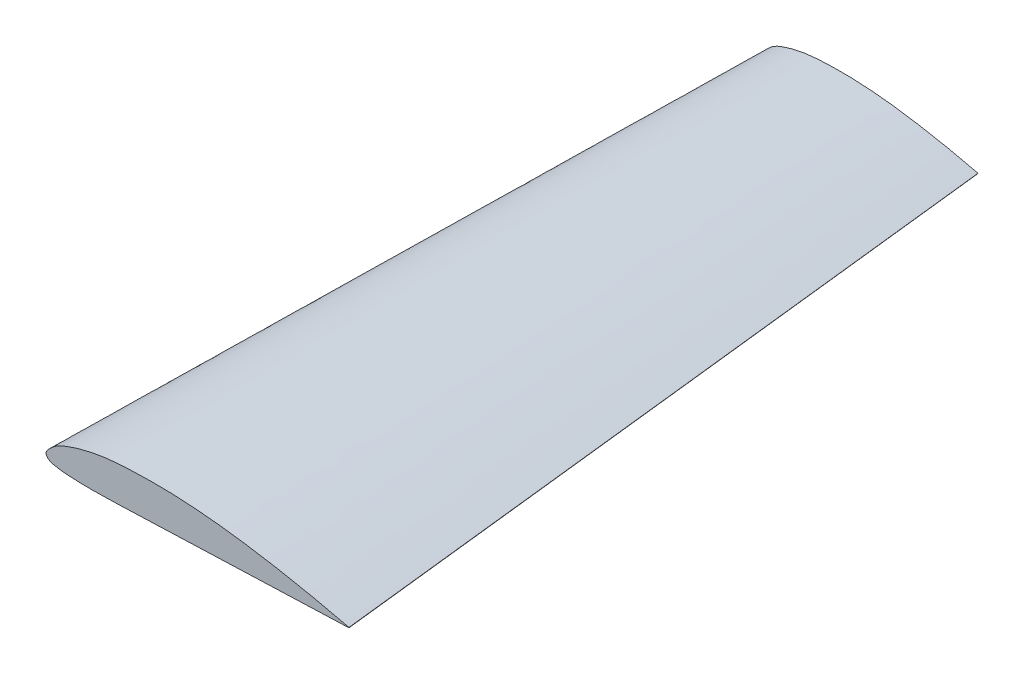
ISO-10303-21;
HEADER;
FILE_DESCRIPTION(('STEP AP214'),'2;1');
FILE_NAME('part.step','',(''),(''),'','','');
FILE_SCHEMA(('AUTOMOTIVE_DESIGN { 1 0 10303 214 1 1 1 1 }'));
ENDSEC;
DATA;
#1=APPLICATION_CONTEXT('core data for automotive mechanical design processes');
#2=APPLICATION_PROTOCOL_DEFINITION('international standard','automotive_design',2000,#1);
#3=PRODUCT_CONTEXT('',#1,'mechanical');
#4=PRODUCT('Part','Part','',(#3));
#5=PRODUCT_RELATED_PRODUCT_CATEGORY('part','',(#4));
#6=PRODUCT_DEFINITION_FORMATION('','',#4);
#7=PRODUCT_DEFINITION_CONTEXT('part definition',#1,'design');
#8=PRODUCT_DEFINITION('design','',#6,#7);
#9=PRODUCT_DEFINITION_SHAPE('','',#8);
#10=(LENGTH_UNIT() NAMED_UNIT(*) SI_UNIT(.MILLI.,.METRE.));
#11=(NAMED_UNIT(*) PLANE_ANGLE_UNIT() SI_UNIT($,.RADIAN.));
#12=(NAMED_UNIT(*) SI_UNIT($,.STERADIAN.) SOLID_ANGLE_UNIT());
#13=UNCERTAINTY_MEASURE_WITH_UNIT(LENGTH_MEASURE(1.E-05),#10,'distance_accuracy_value','');
#14=(GEOMETRIC_REPRESENTATION_CONTEXT(3) GLOBAL_UNCERTAINTY_ASSIGNED_CONTEXT((#13)) GLOBAL_UNIT_ASSIGNED_CONTEXT((#10,
#11,#12)) REPRESENTATION_CONTEXT('',''));
#15=CARTESIAN_POINT('',(0.,0.,0.));
#16=DIRECTION('',(0.,0.,1.));
#17=DIRECTION('',(1.,0.,0.));
#18=AXIS2_PLACEMENT_3D('',#15,#16,#17);
#19=CARTESIAN_POINT('',(12.8168603988164,2.13304577401776,-679.45));
#20=DIRECTION('',(0.,0.,-1.));
#21=DIRECTION('',(-1.,0.,0.));
#22=AXIS2_PLACEMENT_3D('',#19,#20,#21);
#23=PLANE('',#22);
#24=CARTESIAN_POINT('',(215.13815633349,0.121910771375219,-679.45));
#25=CARTESIAN_POINT('',(214.461627755124,0.287633140537885,-679.45));
#26=CARTESIAN_POINT('',(213.110075526926,0.618709231727971,-679.45));
#27=CARTESIAN_POINT('',(211.072202175627,1.07407382505783,-679.45));
#28=CARTESIAN_POINT('',(209.047708211878,1.57931571731317,-679.45));
#29=CARTESIAN_POINT('',(206.335025723878,2.1941886176228,-679.45));
#30=CARTESIAN_POINT('',(202.953557624183,2.98769437172212,-679.45));
#31=CARTESIAN_POINT('',(198.890203629623,3.90389487442927,-679.45));
#32=CARTESIAN_POINT('',(194.827790404657,4.80386244898524,-679.45));
#33=CARTESIAN_POINT('',(190.765256606112,5.68324855934698,-679.45));
#34=CARTESIAN_POINT('',(186.702108723553,6.53929151004852,-679.45));
#35=CARTESIAN_POINT('',(182.642660532388,7.3870883043623,-679.45));
#36=CARTESIAN_POINT('',(178.574031005431,8.16834190715938,-679.45));
#37=CARTESIAN_POINT('',(174.517448076692,8.98425337099883,-679.45));
#38=CARTESIAN_POINT('',(170.448647671062,9.72281472417865,-679.45));
#39=CARTESIAN_POINT('',(166.391523917957,10.4970471799216,-679.45));
#40=CARTESIAN_POINT('',(162.325264552697,11.2012187412181,-679.45));
#41=CARTESIAN_POINT('',(158.265560184403,11.9094790192579,-679.45));
#42=CARTESIAN_POINT('',(154.197683604887,12.5479467883236,-679.45));
#43=CARTESIAN_POINT('',(150.139605517909,13.2202668657995,-679.45));
#44=CARTESIAN_POINT('',(146.073742505185,13.8232141117196,-679.45));
#45=CARTESIAN_POINT('',(142.013236134128,14.4284933351529,-679.45));
#46=CARTESIAN_POINT('',(137.947627508668,14.9706057291833,-679.45));
#47=CARTESIAN_POINT('',(133.888240530522,15.5204263615577,-679.45));
#48=CARTESIAN_POINT('',(129.82162107662,15.9790536434679,-679.45));
#49=CARTESIAN_POINT('',(125.758573586817,16.431325032625,-679.45));
#50=CARTESIAN_POINT('',(121.697975511434,16.8770073746658,-679.45));
#51=CARTESIAN_POINT('',(117.631837295967,17.2327703088552,-679.45));
#52=CARTESIAN_POINT('',(113.569762512434,17.5905536104852,-679.45));
#53=CARTESIAN_POINT('',(109.507034071803,17.9072516278045,-679.45));
#54=CARTESIAN_POINT('',(105.44174698777,18.142632740292,-679.45));
#55=CARTESIAN_POINT('',(101.379082422024,18.3790855703003,-679.45));
#56=CARTESIAN_POINT('',(97.3157119374014,18.5701473352427,-679.45));
#57=CARTESIAN_POINT('',(93.25169220196,18.6979631192171,-679.45));
#58=CARTESIAN_POINT('',(89.1875620448149,18.758524548473,-679.45));
#59=CARTESIAN_POINT('',(85.1237273254981,18.7855451073787,-679.45));
#60=CARTESIAN_POINT('',(81.0597933257808,18.7700945219374,-679.45));
#61=CARTESIAN_POINT('',(76.9958345011567,18.7142216040199,-679.45));
#62=CARTESIAN_POINT('',(72.9317622736009,18.6186635614368,-679.45));
#63=CARTESIAN_POINT('',(68.8678573332756,18.4784207305694,-679.45));
#64=CARTESIAN_POINT('',(64.8022750506451,18.3127317774249,-679.45));
#65=CARTESIAN_POINT('',(60.7376651313413,18.0493154171473,-679.45));
#66=CARTESIAN_POINT('',(56.6715583741981,17.7143915981487,-679.45));
#67=CARTESIAN_POINT('',(52.60475887721,17.2748054416566,-679.45));
#68=CARTESIAN_POINT('',(48.5368072531063,16.7145295151809,-679.45));
#69=CARTESIAN_POINT('',(44.4696352312365,16.0084885761117,-679.45));
#70=CARTESIAN_POINT('',(40.4058892148061,15.1525471084704,-679.45));
#71=CARTESIAN_POINT('',(36.3339504541609,14.1896943309605,-679.45));
#72=CARTESIAN_POINT('',(32.2585901636484,13.0642030914709,-679.45));
#73=CARTESIAN_POINT('',(28.1942977467718,11.713290734651,-679.45));
#74=CARTESIAN_POINT('',(24.7962296292279,10.4638826636869,-679.45));
#75=CARTESIAN_POINT('',(22.0959441999706,9.25949221548522,-679.45));
#76=CARTESIAN_POINT('',(20.0533016162878,8.20108650644846,-679.45));
#77=CARTESIAN_POINT('',(17.9856733335731,6.9628882188768,-679.45));
#78=CARTESIAN_POINT('',(16.076697928172,5.51994943432215,-679.45));
#79=CARTESIAN_POINT('',(14.6339815967281,4.15108521978284,-679.45));
#80=CARTESIAN_POINT('',(13.5544664231668,3.02704135050576,-679.45));
#81=CARTESIAN_POINT('',(12.8553796488538,2.21989769792452,-679.45));
#82=CARTESIAN_POINT('',(12.3940756774489,1.52602711354544,-679.45));
#83=CARTESIAN_POINT('',(12.173110190398,1.06712918763226,-679.45));
#84=CARTESIAN_POINT('',(12.0312090642435,0.673816080280952,-679.45));
#85=CARTESIAN_POINT('',(11.8997018159441,0.106922121723561,-679.45));
#86=CARTESIAN_POINT('',(11.9558628873752,-0.483840935779706,-679.45));
#87=CARTESIAN_POINT('',(12.1758394612667,-0.992014051698573,-679.45));
#88=CARTESIAN_POINT('',(12.3866248079449,-1.403368412154,-679.45));
#89=CARTESIAN_POINT('',(12.841957714916,-2.00024748845596,-679.45));
#90=CARTESIAN_POINT('',(13.5213153027918,-2.63949248012341,-679.45));
#91=CARTESIAN_POINT('',(14.5892915814436,-3.36643737474062,-679.45));
#92=CARTESIAN_POINT('',(16.1035942012592,-3.95545959584553,-679.45));
#93=CARTESIAN_POINT('',(18.0379827737253,-4.33720155880825,-679.45));
#94=CARTESIAN_POINT('',(20.0668386262245,-4.7437273858884,-679.45));
#95=CARTESIAN_POINT('',(22.1007437949092,-5.04814237190061,-679.45));
#96=CARTESIAN_POINT('',(24.8090699579637,-5.34532342561349,-679.45));
#97=CARTESIAN_POINT('',(28.198305191998,-5.56449476584446,-679.45));
#98=CARTESIAN_POINT('',(32.2630359757914,-5.74589414549462,-679.45));
#99=CARTESIAN_POINT('',(36.3268376173975,-5.88637777507348,-679.45));
#100=CARTESIAN_POINT('',(40.3913226140231,-5.9059902482389,-679.45));
#101=CARTESIAN_POINT('',(44.4552635644564,-5.96224211572786,-679.45));
#102=CARTESIAN_POINT('',(48.5186718010782,-5.87079889206543,-679.45));
#103=CARTESIAN_POINT('',(52.5834163882112,-5.84585325811257,-679.45));
#104=CARTESIAN_POINT('',(56.6462590369664,-5.70255305052112,-679.45));
#105=CARTESIAN_POINT('',(60.7107144096735,-5.60054615719551,-679.45));
#106=CARTESIAN_POINT('',(64.774005078364,-5.45165012281856,-679.45));
#107=CARTESIAN_POINT('',(68.8385699308579,-5.32716414193362,-679.45));
#108=CARTESIAN_POINT('',(72.9013167471443,-5.15185667697459,-679.45));
#109=CARTESIAN_POINT('',(76.9663795677223,-5.03365338814612,-679.45));
#110=CARTESIAN_POINT('',(81.0291664427771,-4.85957390609342,-679.45));
#111=CARTESIAN_POINT('',(85.0935710826963,-4.73017668328472,-679.45));
#112=CARTESIAN_POINT('',(89.157936051957,-4.59968085776432,-679.45));
#113=CARTESIAN_POINT('',(93.2208419538443,-4.42889759528012,-679.45));
#114=CARTESIAN_POINT('',(97.285214704454,-4.29861725927932,-679.45));
#115=CARTESIAN_POINT('',(101.349588218249,-4.16835805821858,-679.45));
#116=CARTESIAN_POINT('',(106.766708507238,-3.9405660456554,-679.45));
#117=CARTESIAN_POINT('',(112.187021851742,-3.79392920168495,-679.45));
#118=CARTESIAN_POINT('',(118.958358892466,-3.50919392288966,-679.45));
#119=CARTESIAN_POINT('',(124.378672236358,-3.36255706017908,-679.45));
#120=CARTESIAN_POINT('',(129.795792526876,-3.13476509446928,-679.45));
#121=CARTESIAN_POINT('',(133.860166036391,-3.00450576223564,-679.45));
#122=CARTESIAN_POINT('',(137.924538802971,-2.8742259158015,-679.45));
#123=CARTESIAN_POINT('',(141.987444645249,-2.70344082600662,-679.45));
#124=CARTESIAN_POINT('',(146.051809836945,-2.57295181913593,-679.45));
#125=CARTESIAN_POINT('',(150.116213646706,-2.44352914822967,-679.45));
#126=CARTESIAN_POINT('',(154.179003620324,-2.26954465119212,-679.45));
#127=CARTESIAN_POINT('',(158.244054877825,-2.15098690162749,-679.45));
#128=CARTESIAN_POINT('',(162.306844851464,-1.97700240521967,-679.45));
#129=CARTESIAN_POINT('',(166.371248661143,-1.84757973179484,-679.45));
#130=CARTESIAN_POINT('',(170.43561385315,-1.71709073436901,-679.45));
#131=CARTESIAN_POINT('',(174.498519694268,-1.54630560930904,-679.45));
#132=CARTESIAN_POINT('',(178.562892465175,-1.4160258944706,-679.45));
#133=CARTESIAN_POINT('',(182.627265958541,-1.28576607110368,-679.45));
#134=CARTESIAN_POINT('',(186.690169632013,-1.11492126417963,-679.45));
#135=CARTESIAN_POINT('',(190.754542770925,-0.984651069218046,-679.45));
#136=CARTESIAN_POINT('',(194.818916959679,-0.854412841729266,-679.45));
#137=CARTESIAN_POINT('',(198.881817483236,-0.683472120414775,-679.45));
#138=CARTESIAN_POINT('',(202.946202524654,-0.553563933266129,-679.45));
#139=CARTESIAN_POINT('',(206.333059407276,-0.443908014934658,-679.45));
#140=CARTESIAN_POINT('',(209.042065495297,-0.33902680049291,-679.45));
#141=CARTESIAN_POINT('',(211.073491525938,-0.251790953247334,-679.45));
#142=CARTESIAN_POINT('',(213.106361229738,-0.207431211204091,-679.45));
#143=CARTESIAN_POINT('',(214.460603955381,-0.15042090610083,-679.45));
#144=CARTESIAN_POINT('',(215.13784366651,-0.121910771375068,-679.45));
#145=B_SPLINE_CURVE_WITH_KNOTS('',3,(#24,#25,#26,#27,#28,#29,#30,#31,#32,#33,#34,#35,#36,#37,
#38,#39,#40,#41,#42,#43,#44,#45,#46,#47,#48,#49,#50,#51,#52,#53,#54,#55,#56,#57,#58,#59,#60,#61,
#62,#63,#64,#65,#66,#67,#68,#69,#70,#71,#72,#73,#74,#75,#76,#77,#78,#79,#80,#81,#82,#83,#84,#85,
#86,#87,#88,#89,#90,#91,#92,#93,#94,#95,#96,#97,#98,#99,#100,#101,#102,#103,#104,#105,#106,#107,
#108,#109,#110,#111,#112,#113,#114,#115,#116,#117,#118,#119,#120,#121,#122,#123,#124,#125,#126,
#127,#128,#129,#130,#131,#132,#133,#134,#135,#136,#137,#138,#139,#140,#141,#142,#143,#144),
.UNSPECIFIED.,.F.,.F.,(4,1,1,1,1,1,1,1,1,1,1,1,1,1,1,1,1,1,1,1,1,1,1,1,1,1,1,1,1,1,1,1,1,1,1,1,
1,1,1,1,1,1,1,1,1,1,1,1,1,1,1,1,1,1,1,1,1,1,1,1,1,1,1,1,1,1,1,1,1,1,1,1,1,1,1,1,1,1,1,1,1,1,1,1,
1,1,1,1,1,1,1,1,1,1,1,1,1,1,1,1,1,1,1,1,1,1,1,1,1,1,1,1,1,1,1,1,1,1,4),(0.,0.00503122634557403,
0.0100512607972086,0.0150824871427825,0.0201025215944171,0.0301425904976863,0.0401718067519296,
0.0501903975054945,0.0601985906302054,0.0701966147088251,0.0801846990222892,0.0901535943757596,
0.10012248972923,0.11007312129553,0.120023752861829,0.12995705091697,0.139882032603394,
0.149791085266802,0.159700137930211,0.169594203605189,0.179481130398163,0.189354491215562,
0.199221425918021,0.209070515303594,0.218914135369468,0.228752526355731,0.238576675291738,
0.248396559771628,0.258208641595819,0.268010839279087,0.277810228537083,0.287604731659173,
0.297393734963131,0.307179436892509,0.316964160422912,0.326748883953315,0.336534585882693,
0.346322244316613,0.356112836774261,0.365907339896351,0.375712589303432,0.385532473783322,
0.395376093849195,0.405256118857239,0.415189416912379,0.425187440990999,0.435249893682147,
0.445410814571545,0.455714422442787,0.46618165938066,0.471546485831251,0.477060696794139,
0.482791374930262,0.488936229142053,0.494301055592644,0.497138589947503,0.500195397088939,
0.502000251592252,0.503138171688505,0.503865464460785,0.50501697526504,0.50732933138354,
0.507965330463077,0.509015751951455,0.510659594077608,0.513358796523916,0.515719806809555,
0.519953555254083,0.524973589705718,0.529953413450285,0.534900446287774,0.539822256320711,
0.549630800523053,0.559425303645143,0.569214306949101,0.578999397390584,0.588784120920987,
0.598569822850365,0.608355524779743,0.618144528083701,0.627933531387658,0.637724123845305,
0.647514716302953,0.657307142079014,0.667097734536661,0.676890160312722,0.68668075277037,
0.696471345228017,0.706263771004078,0.716054363461726,0.725844955919373,0.735637381695434,
0.75521856661073,0.76501099238679,0.784592177302086,0.794384603078146,0.804175195535794,
0.813965787993442,0.823758213769502,0.83354880622715,0.843339398684798,0.853131824460858,
0.862922416918506,0.872714842694567,0.882505435152214,0.892296027609862,0.902088453385923,
0.91187904584357,0.921669638301218,0.931462064077279,0.941252656534927,0.951043248992574,
0.960835674768635,0.970626267226283,0.98041685968393,0.985313072571961,0.990209285459991,
0.99510378711197,1.),.UNSPECIFIED.);
#146=CARTESIAN_POINT('',(215.13815633349,0.121910771375168,-679.45));
#147=VERTEX_POINT('',#146);
#148=CARTESIAN_POINT('',(215.13784366651,-0.121910771375119,-679.45));
#149=VERTEX_POINT('',#148);
#150=EDGE_CURVE('E49',#147,#149,#145,.T.);
#151=ORIENTED_EDGE('',*,*,#150,.F.);
#152=DIRECTION('',(0.00128235888977293,0.999999177777501,0.));
#153=VECTOR('',#152,1.);
#154=CARTESIAN_POINT('',(215.13784366651,-0.121910771375119,-679.45));
#155=LINE('',#154,#153);
#156=EDGE_CURVE('E11',#149,#147,#155,.T.);
#157=ORIENTED_EDGE('',*,*,#156,.F.);
#158=EDGE_LOOP('',(#151,#157));
#159=FACE_BOUND('',#158,.T.);
#160=ADVANCED_FACE('F50',(#159),#23,.T.);
#161=CARTESIAN_POINT('',(1.25395659407719,2.68158603818455,0.));
#162=DIRECTION('',(0.,0.,-1.));
#163=DIRECTION('',(-1.,0.,0.));
#164=AXIS2_PLACEMENT_3D('',#161,#162,#163);
#165=PLANE('',#164);
#166=CARTESIAN_POINT('',(290.83,0.174485076899337,0.));
#167=CARTESIAN_POINT('',(289.86141431775,0.410433530204628,0.));
#168=CARTESIAN_POINT('',(287.926397558804,0.881805572719821,0.));
#169=CARTESIAN_POINT('',(285.008855584873,1.529805873877,0.));
#170=CARTESIAN_POINT('',(282.110371315524,2.249217614711,0.));
#171=CARTESIAN_POINT('',(278.226716015357,3.12427564857863,0.));
#172=CARTESIAN_POINT('',(273.385533458274,4.25377447797655,0.));
#173=CARTESIAN_POINT('',(267.568176531703,5.55762864661307,0.));
#174=CARTESIAN_POINT('',(261.752195875157,6.83825116370874,0.));
#175=CARTESIAN_POINT('',(255.936080422435,8.08941623914213,0.));
#176=CARTESIAN_POINT('',(250.119128905491,9.30717029053491,0.));
#177=CARTESIAN_POINT('',(244.307487706619,10.5131288210343,0.));
#178=CARTESIAN_POINT('',(238.482827852898,11.6238305583097,0.));
#179=CARTESIAN_POINT('',(232.675346082458,12.784158468815,0.));
#180=CARTESIAN_POINT('',(226.85052001504,13.8337566107458,0.));
#181=CARTESIAN_POINT('',(221.042340686454,14.9344304488302,0.));
#182=CARTESIAN_POINT('',(215.221214601288,15.9348128653375,0.));
#183=CARTESIAN_POINT('',(209.409462851106,16.9410592885262,0.));
#184=CARTESIAN_POINT('',(203.586142719329,17.8474001850462,0.));
#185=CARTESIAN_POINT('',(197.776784548101,18.8022101814788,0.));
#186=CARTESIAN_POINT('',(191.956411527344,19.6577160253575,0.));
#187=CARTESIAN_POINT('',(186.143700919845,20.5165693434824,0.));
#188=CARTESIAN_POINT('',(180.323803645783,21.2850057732703,0.));
#189=CARTESIAN_POINT('',(174.512796956832,22.0644860381616,0.));
#190=CARTESIAN_POINT('',(168.691606161285,22.7134325470453,0.));
#191=CARTESIAN_POINT('',(162.875539404772,23.3532887404108,0.));
#192=CARTESIAN_POINT('',(157.062990466008,23.9837188557758,0.));
#193=CARTESIAN_POINT('',(151.242677237889,24.4854416515568,0.));
#194=CARTESIAN_POINT('',(145.428176088539,24.9900635561433,0.));
#195=CARTESIAN_POINT('',(139.612814799487,25.4358809483791,0.));
#196=CARTESIAN_POINT('',(133.793940699329,25.7653088255393,0.));
#197=CARTESIAN_POINT('',(127.978818111429,26.0962754116992,0.));
#198=CARTESIAN_POINT('',(122.162768486892,26.3622747409373,0.));
#199=CARTESIAN_POINT('',(116.34590570239,26.5377520691051,0.));
#200=CARTESIAN_POINT('',(110.529008313965,26.6169714002783,0.));
#201=CARTESIAN_POINT('',(104.712595331093,26.6481859034328,0.));
#202=CARTESIAN_POINT('',(98.8961182037374,26.6186133995678,0.));
#203=CARTESIAN_POINT('',(93.0796797359803,26.5311863873011,0.));
#204=CARTESIAN_POINT('',(87.2631517974696,26.3869598327282,0.));
#205=CARTESIAN_POINT('',(81.4469453022673,26.1787784825313,0.));
#206=CARTESIAN_POINT('',(75.6283848141565,25.9341742915949,0.));
#207=CARTESIAN_POINT('',(69.8113953877437,25.5496995351054,0.));
#208=CARTESIAN_POINT('',(63.9923948553843,25.0628769819754,0.));
#209=CARTESIAN_POINT('',(58.1725949340462,24.4262551882097,0.));
#210=CARTESIAN_POINT('',(52.3513675420956,23.6168940481134,0.));
#211=CARTESIAN_POINT('',(46.5315234896791,22.598908166475,0.));
#212=CARTESIAN_POINT('',(40.7168580315844,21.3663834432527,0.));
#213=CARTESIAN_POINT('',(34.890662931066,19.9808268723716,0.));
#214=CARTESIAN_POINT('',(29.059869268968,18.3624877250668,0.));
#215=CARTESIAN_POINT('',(23.2453302337508,16.4215349201997,0.));
#216=CARTESIAN_POINT('',(18.3841384197178,14.6270828963545,0.));
#217=CARTESIAN_POINT('',(14.5215654450137,12.8983430392644,0.));
#218=CARTESIAN_POINT('',(11.599975847482,11.3797508612164,0.));
#219=CARTESIAN_POINT('',(8.64295545581205,9.60378469925065,0.));
#220=CARTESIAN_POINT('',(5.91338276889718,7.53507489154761,0.));
#221=CARTESIAN_POINT('',(3.85100742079764,5.57324007271503,0.));
#222=CARTESIAN_POINT('',(2.30801438747216,3.96247098119062,0.));
#223=CARTESIAN_POINT('',(1.30892786411925,2.80596355053383,0.));
#224=CARTESIAN_POINT('',(0.649960075523071,1.81201461853268,0.));
#225=CARTESIAN_POINT('',(0.334545476011859,1.15481141283316,0.));
#226=CARTESIAN_POINT('',(0.132171369109949,0.591621590821043,0.));
#227=CARTESIAN_POINT('',(-0.0550079138295531,-0.219986745564128,0.));
#228=CARTESIAN_POINT('',(0.0264568922509669,-1.06541328726931,0.));
#229=CARTESIAN_POINT('',(0.342231050395441,-1.79233231282765,0.));
#230=CARTESIAN_POINT('',(0.644672565728293,-2.38069636524275,0.));
#231=CARTESIAN_POINT('',(1.2974632815142,-3.23414382770816,0.));
#232=CARTESIAN_POINT('',(2.27096707642826,-4.14781633610421,0.));
#233=CARTESIAN_POINT('',(3.80084232997736,-5.18629606741227,0.));
#234=CARTESIAN_POINT('',(5.96926901340435,-6.02655479663045,0.));
#235=CARTESIAN_POINT('',(8.738563273625,-6.56937264266873,0.));
#236=CARTESIAN_POINT('',(11.6431093149327,-7.14748901077269,0.));
#237=CARTESIAN_POINT('',(14.5546947780103,-7.57944997150464,0.));
#238=CARTESIAN_POINT('',(18.431532003639,-7.9998195495035,0.));
#239=CARTESIAN_POINT('',(23.2827771510966,-8.30728800078783,0.));
#240=CARTESIAN_POINT('',(29.1007559696777,-8.55945554453759,0.));
#241=CARTESIAN_POINT('',(34.9173298576618,-8.75306412684895,0.));
#242=CARTESIAN_POINT('',(40.7346599532894,-8.77367461387807,0.));
#243=CARTESIAN_POINT('',(46.5512786299366,-8.84672623209345,0.));
#244=CARTESIAN_POINT('',(52.3668637836782,-8.70839023072214,0.));
#245=CARTESIAN_POINT('',(58.184483637262,-8.66522645106263,0.));
#246=CARTESIAN_POINT('',(63.9991641162273,-8.45267118017482,0.));
#247=CARTESIAN_POINT('',(69.8162285951542,-8.29921400484332,0.));
#248=CARTESIAN_POINT('',(75.6315400321908,-8.07864888465471,0.));
#249=CARTESIAN_POINT('',(81.4487199464462,-7.89301831460524,0.));
#250=CARTESIAN_POINT('',(87.2632045197867,-7.63465283290908,0.));
#251=CARTESIAN_POINT('',(93.0811086819688,-7.4580134518254,0.));
#252=CARTESIAN_POINT('',(98.8956528432335,-7.20140544712521,0.));
#253=CARTESIAN_POINT('',(104.71259443926,-7.00874595618586,0.));
#254=CARTESIAN_POINT('',(110.529477240306,-6.81451416294013,0.));
#255=CARTESIAN_POINT('',(116.344197808531,-6.5626236539959,0.));
#256=CARTESIAN_POINT('',(122.161092142137,-6.36870026584062,0.));
#257=CARTESIAN_POINT('',(127.977987606842,-6.1748071256673,0.));
#258=CARTESIAN_POINT('',(135.730822866666,-5.8388373490784,0.));
#259=CARTESIAN_POINT('',(143.488377137537,-5.61901504603507,0.));
#260=CARTESIAN_POINT('',(153.179330593528,-5.1990597212165,0.));
#261=CARTESIAN_POINT('',(160.936884863489,-4.97923739135249,0.));
#262=CARTESIAN_POINT('',(168.689720125587,-4.64326768181968,0.));
#263=CARTESIAN_POINT('',(174.506615583927,-4.44937435391299,0.));
#264=CARTESIAN_POINT('',(180.32350994129,-4.25545166642068,0.));
#265=CARTESIAN_POINT('',(186.138230420844,-4.00355854224748,0.));
#266=CARTESIAN_POINT('',(191.955113552766,-3.8093365077858,0.));
#267=CARTESIAN_POINT('',(197.772053913922,-3.61664059578082,0.));
#268=CARTESIAN_POINT('',(203.586602684339,-3.36016853269529,0.));
#269=CARTESIAN_POINT('',(209.404489646298,-3.18302185091016,0.));
#270=CARTESIAN_POINT('',(215.219038416746,-2.92654978872589,0.));
#271=CARTESIAN_POINT('',(221.035978777779,-2.73385387311636,0.));
#272=CARTESIAN_POINT('',(226.852861910162,-2.53963185217207,0.));
#273=CARTESIAN_POINT('',(232.667582387992,-2.28773867752784,0.));
#274=CARTESIAN_POINT('',(238.484476751789,-2.09381617837391,0.));
#275=CARTESIAN_POINT('',(244.301372186113,-1.89992214756238,0.));
#276=CARTESIAN_POINT('',(250.116089451962,-1.6479435572294,0.));
#277=CARTESIAN_POINT('',(255.932984359939,-1.45403468272367,0.));
#278=CARTESIAN_POINT('',(261.749880829174,-1.26017155973614,0.));
#279=CARTESIAN_POINT('',(267.564593410667,-1.00805569771435,0.));
#280=CARTESIAN_POINT('',(273.381506018526,-0.814664925040672,0.));
#281=CARTESIAN_POINT('',(278.228743628354,-0.651503731894596,0.));
#282=CARTESIAN_POINT('',(282.10581606048,-0.49642044583061,0.));
#283=CARTESIAN_POINT('',(285.013134430076,-0.36783570663608,0.));
#284=CARTESIAN_POINT('',(287.922597750708,-0.300614742777462,0.));
#285=CARTESIAN_POINT('',(289.860752998991,-0.216533197492379,0.));
#286=CARTESIAN_POINT('',(290.83,-0.174485076899338,0.));
#287=B_SPLINE_CURVE_WITH_KNOTS('',3,(#166,#167,#168,#169,#170,#171,#172,#173,#174,#175,#176,
#177,#178,#179,#180,#181,#182,#183,#184,#185,#186,#187,#188,#189,#190,#191,#192,#193,#194,#195,
#196,#197,#198,#199,#200,#201,#202,#203,#204,#205,#206,#207,#208,#209,#210,#211,#212,#213,#214,
#215,#216,#217,#218,#219,#220,#221,#222,#223,#224,#225,#226,#227,#228,#229,#230,#231,#232,#233,
#234,#235,#236,#237,#238,#239,#240,#241,#242,#243,#244,#245,#246,#247,#248,#249,#250,#251,#252,
#253,#254,#255,#256,#257,#258,#259,#260,#261,#262,#263,#264,#265,#266,#267,#268,#269,#270,#271,
#272,#273,#274,#275,#276,#277,#278,#279,#280,#281,#282,#283,#284,#285,#286),.UNSPECIFIED.,.F.,
.F.,(4,1,1,1,1,1,1,1,1,1,1,1,1,1,1,1,1,1,1,1,1,1,1,1,1,1,1,1,1,1,1,1,1,1,1,1,1,1,1,1,1,1,1,1,1,
1,1,1,1,1,1,1,1,1,1,1,1,1,1,1,1,1,1,1,1,1,1,1,1,1,1,1,1,1,1,1,1,1,1,1,1,1,1,1,1,1,1,1,1,1,1,1,1,
1,1,1,1,1,1,1,1,1,1,1,1,1,1,1,1,1,1,1,1,1,1,1,1,1,4),(0.,0.00503122634557403,0.0100512607972086,
0.0150824871427825,0.0201025215944171,0.0301425904976863,0.0401718067519296,0.0501903975054945,
0.0601985906302054,0.0701966147088251,0.0801846990222892,0.0901535943757596,0.10012248972923,
0.11007312129553,0.120023752861829,0.12995705091697,0.139882032603394,0.149791085266802,
0.159700137930211,0.169594203605189,0.179481130398163,0.189354491215562,0.199221425918021,
0.209070515303594,0.218914135369468,0.228752526355731,0.238576675291738,0.248396559771628,
0.258208641595819,0.268010839279087,0.277810228537083,0.287604731659173,0.297393734963131,
0.307179436892509,0.316964160422912,0.326748883953315,0.336534585882693,0.346322244316613,
0.356112836774261,0.365907339896351,0.375712589303432,0.385532473783322,0.395376093849195,
0.405256118857239,0.415189416912379,0.425187440990999,0.435249893682147,0.445410814571545,
0.455714422442787,0.46618165938066,0.471546485831251,0.477060696794139,0.482791374930262,
0.488936229142053,0.494301055592644,0.497138589947503,0.500195397088939,0.502000251592252,
0.503138171688505,0.503865464460785,0.50501697526504,0.50732933138354,0.507965330463077,
0.509015751951455,0.510659594077608,0.513358796523916,0.515719806809555,0.519953555254083,
0.524973589705718,0.529953413450285,0.534900446287774,0.539822256320711,0.549630800523053,
0.559425303645143,0.569214306949101,0.578999397390584,0.588784120920987,0.598569822850365,
0.608355524779743,0.618144528083701,0.627933531387658,0.637724123845305,0.647514716302953,
0.657307142079014,0.667097734536661,0.676890160312722,0.68668075277037,0.696471345228017,
0.706263771004078,0.716054363461726,0.725844955919373,0.735637381695434,0.75521856661073,
0.76501099238679,0.784592177302086,0.794384603078146,0.804175195535794,0.813965787993442,
0.823758213769502,0.83354880622715,0.843339398684798,0.853131824460858,0.862922416918506,
0.872714842694567,0.882505435152214,0.892296027609862,0.902088453385923,0.91187904584357,
0.921669638301218,0.931462064077279,0.941252656534927,0.951043248992574,0.960835674768635,
0.970626267226283,0.98041685968393,0.985313072571961,0.990209285459991,0.99510378711197,1.),.UNSPECIFIED.);
#288=CARTESIAN_POINT('',(290.83,0.174485076899337,0.));
#289=VERTEX_POINT('',#288);
#290=CARTESIAN_POINT('',(290.83,-0.174485076899337,0.));
#291=VERTEX_POINT('',#290);
#292=EDGE_CURVE('E80',#289,#291,#287,.T.);
#293=ORIENTED_EDGE('',*,*,#292,.T.);
#294=DIRECTION('',(0.,1.,0.));
#295=VECTOR('',#294,1.);
#296=CARTESIAN_POINT('',(290.83,-0.174485076899337,0.));
#297=LINE('',#296,#295);
#298=EDGE_CURVE('E81',#291,#289,#297,.T.);
#299=ORIENTED_EDGE('',*,*,#298,.T.);
#300=EDGE_LOOP('',(#293,#299));
#301=FACE_BOUND('',#300,.T.);
#302=ADVANCED_FACE('F88',(#301),#165,.F.);
#303=CARTESIAN_POINT('',(290.83,0.174485076899337,0.));
#304=CARTESIAN_POINT('',(215.13815633349,0.121910771375168,-679.45));
#305=CARTESIAN_POINT('',(290.83,0.116323384599558,0.));
#306=CARTESIAN_POINT('',(215.138104222327,0.0812738475834539,-679.45));
#307=CARTESIAN_POINT('',(290.83,0.0581616922997791,0.));
#308=CARTESIAN_POINT('',(215.138052111163,0.0406369237917393,-679.45));
#309=CARTESIAN_POINT('',(290.83,-0.0581616922997791,0.));
#310=CARTESIAN_POINT('',(215.137947888837,-0.0406369237916898,-679.45));
#311=CARTESIAN_POINT('',(290.83,-0.116323384599558,0.));
#312=CARTESIAN_POINT('',(215.137895777673,-0.0812738475834043,-679.45));
#313=CARTESIAN_POINT('',(290.83,-0.174485076899337,0.));
#314=CARTESIAN_POINT('',(215.13784366651,-0.121910771375119,-679.45));
#315=B_SPLINE_SURFACE_WITH_KNOTS('',3,1,((#303,#304),(#305,#306),(#307,#308),(#309,#310),(#311,
#312),(#313,#314)),.UNSPECIFIED.,.F.,.F.,.F.,(4,2,4),(2,2),(0.,0.5,1.),(0.,1.),.UNSPECIFIED.);
#316=DIRECTION('',(-0.110717193494226,7.69020178511414E-05,-0.993851949311788));
#317=VECTOR('',#316,1.);
#318=CARTESIAN_POINT('',(252.983921833255,-0.148197924137228,-339.725));
#319=LINE('',#318,#317);
#320=EDGE_CURVE('E73',#291,#149,#319,.T.);
#321=DIRECTION('',(0.110716741753097,7.69020217450887E-05,0.993851999636594));
#322=VECTOR('',#321,1.);
#323=CARTESIAN_POINT('',(252.984078166745,0.148197924137253,-339.725));
#324=LINE('',#323,#322);
#325=EDGE_CURVE('E61',#147,#289,#324,.T.);
#326=ORIENTED_EDGE('',*,*,#298,.F.);
#327=ORIENTED_EDGE('',*,*,#320,.T.);
#328=ORIENTED_EDGE('',*,*,#156,.T.);
#329=ORIENTED_EDGE('',*,*,#325,.T.);
#330=EDGE_LOOP('',(#326,#327,#328,#329));
#331=FACE_BOUND('',#330,.T.);
#332=ADVANCED_FACE('F84',(#331),#315,.T.);
#333=CARTESIAN_POINT('',(290.83,-0.174485076899338,0.));
#334=CARTESIAN_POINT('',(215.13784366651,-0.121910771375068,-679.45));
#335=CARTESIAN_POINT('',(289.860752998991,-0.216533197492379,0.));
#336=CARTESIAN_POINT('',(214.460603955381,-0.15042090610083,-679.45));
#337=CARTESIAN_POINT('',(287.922597750708,-0.300614742777462,0.));
#338=CARTESIAN_POINT('',(213.106361229738,-0.207431211204091,-679.45));
#339=CARTESIAN_POINT('',(285.013134430076,-0.36783570663608,0.));
#340=CARTESIAN_POINT('',(211.073491525938,-0.251790953247334,-679.45));
#341=CARTESIAN_POINT('',(282.10581606048,-0.49642044583061,0.));
#342=CARTESIAN_POINT('',(209.042065495297,-0.33902680049291,-679.45));
#343=CARTESIAN_POINT('',(278.228743628354,-0.651503731894596,0.));
#344=CARTESIAN_POINT('',(206.333059407276,-0.443908014934658,-679.45));
#345=CARTESIAN_POINT('',(273.381506018526,-0.814664925040672,0.));
#346=CARTESIAN_POINT('',(202.946202524654,-0.553563933266129,-679.45));
#347=CARTESIAN_POINT('',(267.564593410667,-1.00805569771435,0.));
#348=CARTESIAN_POINT('',(198.881817483236,-0.683472120414775,-679.45));
#349=CARTESIAN_POINT('',(261.749880829174,-1.26017155973614,0.));
#350=CARTESIAN_POINT('',(194.818916959679,-0.854412841729266,-679.45));
#351=CARTESIAN_POINT('',(255.932984359939,-1.45403468272367,0.));
#352=CARTESIAN_POINT('',(190.754542770925,-0.984651069218046,-679.45));
#353=CARTESIAN_POINT('',(250.116089451962,-1.6479435572294,0.));
#354=CARTESIAN_POINT('',(186.690169632013,-1.11492126417963,-679.45));
#355=CARTESIAN_POINT('',(244.301372186113,-1.89992214756238,0.));
#356=CARTESIAN_POINT('',(182.627265958541,-1.28576607110368,-679.45));
#357=CARTESIAN_POINT('',(238.484476751789,-2.09381617837391,0.));
#358=CARTESIAN_POINT('',(178.562892465175,-1.4160258944706,-679.45));
#359=CARTESIAN_POINT('',(232.667582387992,-2.28773867752784,0.));
#360=CARTESIAN_POINT('',(174.498519694268,-1.54630560930904,-679.45));
#361=CARTESIAN_POINT('',(226.852861910162,-2.53963185217207,0.));
#362=CARTESIAN_POINT('',(170.43561385315,-1.71709073436901,-679.45));
#363=CARTESIAN_POINT('',(221.035978777779,-2.73385387311636,0.));
#364=CARTESIAN_POINT('',(166.371248661143,-1.84757973179484,-679.45));
#365=CARTESIAN_POINT('',(215.219038416746,-2.92654978872589,0.));
#366=CARTESIAN_POINT('',(162.306844851464,-1.97700240521967,-679.45));
#367=CARTESIAN_POINT('',(209.404489646298,-3.18302185091016,0.));
#368=CARTESIAN_POINT('',(158.244054877825,-2.15098690162749,-679.45));
#369=CARTESIAN_POINT('',(203.586602684339,-3.36016853269529,0.));
#370=CARTESIAN_POINT('',(154.179003620324,-2.26954465119212,-679.45));
#371=CARTESIAN_POINT('',(197.772053913922,-3.61664059578082,0.));
#372=CARTESIAN_POINT('',(150.116213646706,-2.44352914822967,-679.45));
#373=CARTESIAN_POINT('',(191.955113552766,-3.8093365077858,0.));
#374=CARTESIAN_POINT('',(146.051809836945,-2.57295181913593,-679.45));
#375=CARTESIAN_POINT('',(186.138230420844,-4.00355854224748,0.));
#376=CARTESIAN_POINT('',(141.987444645249,-2.70344082600662,-679.45));
#377=CARTESIAN_POINT('',(180.32350994129,-4.25545166642068,0.));
#378=CARTESIAN_POINT('',(137.924538802971,-2.8742259158015,-679.45));
#379=CARTESIAN_POINT('',(174.506615583927,-4.44937435391299,0.));
#380=CARTESIAN_POINT('',(133.860166036391,-3.00450576223564,-679.45));
#381=CARTESIAN_POINT('',(168.689720125587,-4.64326768181968,0.));
#382=CARTESIAN_POINT('',(129.795792526876,-3.13476509446928,-679.45));
#383=CARTESIAN_POINT('',(160.936884863489,-4.97923739135249,0.));
#384=CARTESIAN_POINT('',(124.378672236358,-3.36255706017908,-679.45));
#385=CARTESIAN_POINT('',(153.179330593528,-5.1990597212165,0.));
#386=CARTESIAN_POINT('',(118.958358892466,-3.50919392288966,-679.45));
#387=CARTESIAN_POINT('',(143.488377137537,-5.61901504603507,0.));
#388=CARTESIAN_POINT('',(112.187021851742,-3.79392920168495,-679.45));
#389=CARTESIAN_POINT('',(135.730822866666,-5.8388373490784,0.));
#390=CARTESIAN_POINT('',(106.766708507238,-3.9405660456554,-679.45));
#391=CARTESIAN_POINT('',(127.977987606842,-6.1748071256673,0.));
#392=CARTESIAN_POINT('',(101.349588218249,-4.16835805821858,-679.45));
#393=CARTESIAN_POINT('',(122.161092142137,-6.36870026584062,0.));
#394=CARTESIAN_POINT('',(97.285214704454,-4.29861725927932,-679.45));
#395=CARTESIAN_POINT('',(116.344197808531,-6.5626236539959,0.));
#396=CARTESIAN_POINT('',(93.2208419538443,-4.42889759528012,-679.45));
#397=CARTESIAN_POINT('',(110.529477240306,-6.81451416294013,0.));
#398=CARTESIAN_POINT('',(89.157936051957,-4.59968085776432,-679.45));
#399=CARTESIAN_POINT('',(104.71259443926,-7.00874595618586,0.));
#400=CARTESIAN_POINT('',(85.0935710826963,-4.73017668328472,-679.45));
#401=CARTESIAN_POINT('',(98.8956528432335,-7.20140544712521,0.));
#402=CARTESIAN_POINT('',(81.0291664427771,-4.85957390609342,-679.45));
#403=CARTESIAN_POINT('',(93.0811086819688,-7.4580134518254,0.));
#404=CARTESIAN_POINT('',(76.9663795677223,-5.03365338814612,-679.45));
#405=CARTESIAN_POINT('',(87.2632045197867,-7.63465283290908,0.));
#406=CARTESIAN_POINT('',(72.9013167471443,-5.15185667697459,-679.45));
#407=CARTESIAN_POINT('',(81.4487199464462,-7.89301831460524,0.));
#408=CARTESIAN_POINT('',(68.8385699308579,-5.32716414193362,-679.45));
#409=CARTESIAN_POINT('',(75.6315400321908,-8.07864888465471,0.));
#410=CARTESIAN_POINT('',(64.774005078364,-5.45165012281856,-679.45));
#411=CARTESIAN_POINT('',(69.8162285951542,-8.29921400484332,0.));
#412=CARTESIAN_POINT('',(60.7107144096735,-5.60054615719551,-679.45));
#413=CARTESIAN_POINT('',(63.9991641162273,-8.45267118017482,0.));
#414=CARTESIAN_POINT('',(56.6462590369664,-5.70255305052112,-679.45));
#415=CARTESIAN_POINT('',(58.184483637262,-8.66522645106263,0.));
#416=CARTESIAN_POINT('',(52.5834163882112,-5.84585325811257,-679.45));
#417=CARTESIAN_POINT('',(52.3668637836782,-8.70839023072214,0.));
#418=CARTESIAN_POINT('',(48.5186718010782,-5.87079889206543,-679.45));
#419=CARTESIAN_POINT('',(46.5512786299366,-8.84672623209345,0.));
#420=CARTESIAN_POINT('',(44.4552635644564,-5.96224211572786,-679.45));
#421=CARTESIAN_POINT('',(40.7346599532894,-8.77367461387807,0.));
#422=CARTESIAN_POINT('',(40.3913226140231,-5.9059902482389,-679.45));
#423=CARTESIAN_POINT('',(34.9173298576618,-8.75306412684895,0.));
#424=CARTESIAN_POINT('',(36.3268376173975,-5.88637777507348,-679.45));
#425=CARTESIAN_POINT('',(29.1007559696777,-8.55945554453759,0.));
#426=CARTESIAN_POINT('',(32.2630359757914,-5.74589414549462,-679.45));
#427=CARTESIAN_POINT('',(23.2827771510966,-8.30728800078783,0.));
#428=CARTESIAN_POINT('',(28.198305191998,-5.56449476584446,-679.45));
#429=CARTESIAN_POINT('',(18.431532003639,-7.9998195495035,0.));
#430=CARTESIAN_POINT('',(24.8090699579637,-5.34532342561349,-679.45));
#431=CARTESIAN_POINT('',(14.5546947780103,-7.57944997150464,0.));
#432=CARTESIAN_POINT('',(22.1007437949092,-5.04814237190061,-679.45));
#433=CARTESIAN_POINT('',(11.6431093149327,-7.14748901077269,0.));
#434=CARTESIAN_POINT('',(20.0668386262245,-4.7437273858884,-679.45));
#435=CARTESIAN_POINT('',(8.738563273625,-6.56937264266873,0.));
#436=CARTESIAN_POINT('',(18.0379827737253,-4.33720155880825,-679.45));
#437=CARTESIAN_POINT('',(5.96926901340435,-6.02655479663045,0.));
#438=CARTESIAN_POINT('',(16.1035942012592,-3.95545959584553,-679.45));
#439=CARTESIAN_POINT('',(3.80084232997736,-5.18629606741227,0.));
#440=CARTESIAN_POINT('',(14.5892915814436,-3.36643737474062,-679.45));
#441=CARTESIAN_POINT('',(2.27096707642826,-4.14781633610421,0.));
#442=CARTESIAN_POINT('',(13.5213153027918,-2.63949248012341,-679.45));
#443=CARTESIAN_POINT('',(1.2974632815142,-3.23414382770816,0.));
#444=CARTESIAN_POINT('',(12.841957714916,-2.00024748845596,-679.45));
#445=CARTESIAN_POINT('',(0.644672565728293,-2.38069636524275,0.));
#446=CARTESIAN_POINT('',(12.3866248079449,-1.403368412154,-679.45));
#447=CARTESIAN_POINT('',(0.342231050395441,-1.79233231282765,0.));
#448=CARTESIAN_POINT('',(12.1758394612667,-0.992014051698573,-679.45));
#449=CARTESIAN_POINT('',(0.0264568922509669,-1.06541328726931,0.));
#450=CARTESIAN_POINT('',(11.9558628873752,-0.483840935779706,-679.45));
#451=CARTESIAN_POINT('',(-0.0550079138295531,-0.219986745564128,0.));
#452=CARTESIAN_POINT('',(11.8997018159441,0.106922121723561,-679.45));
#453=CARTESIAN_POINT('',(0.132171369109949,0.591621590821043,0.));
#454=CARTESIAN_POINT('',(12.0312090642435,0.673816080280952,-679.45));
#455=CARTESIAN_POINT('',(0.334545476011859,1.15481141283316,0.));
#456=CARTESIAN_POINT('',(12.173110190398,1.06712918763226,-679.45));
#457=CARTESIAN_POINT('',(0.649960075523071,1.81201461853268,0.));
#458=CARTESIAN_POINT('',(12.3940756774489,1.52602711354544,-679.45));
#459=CARTESIAN_POINT('',(1.30892786411925,2.80596355053383,0.));
#460=CARTESIAN_POINT('',(12.8553796488538,2.21989769792452,-679.45));
#461=CARTESIAN_POINT('',(2.30801438747216,3.96247098119062,0.));
#462=CARTESIAN_POINT('',(13.5544664231668,3.02704135050576,-679.45));
#463=CARTESIAN_POINT('',(3.85100742079764,5.57324007271503,0.));
#464=CARTESIAN_POINT('',(14.6339815967281,4.15108521978284,-679.45));
#465=CARTESIAN_POINT('',(5.91338276889718,7.53507489154761,0.));
#466=CARTESIAN_POINT('',(16.076697928172,5.51994943432215,-679.45));
#467=CARTESIAN_POINT('',(8.64295545581205,9.60378469925065,0.));
#468=CARTESIAN_POINT('',(17.9856733335731,6.9628882188768,-679.45));
#469=CARTESIAN_POINT('',(11.599975847482,11.3797508612164,0.));
#470=CARTESIAN_POINT('',(20.0533016162878,8.20108650644846,-679.45));
#471=CARTESIAN_POINT('',(14.5215654450137,12.8983430392644,0.));
#472=CARTESIAN_POINT('',(22.0959441999706,9.25949221548522,-679.45));
#473=CARTESIAN_POINT('',(18.3841384197178,14.6270828963545,0.));
#474=CARTESIAN_POINT('',(24.7962296292279,10.4638826636869,-679.45));
#475=CARTESIAN_POINT('',(23.2453302337508,16.4215349201997,0.));
#476=CARTESIAN_POINT('',(28.1942977467718,11.713290734651,-679.45));
#477=CARTESIAN_POINT('',(29.059869268968,18.3624877250668,0.));
#478=CARTESIAN_POINT('',(32.2585901636484,13.0642030914709,-679.45));
#479=CARTESIAN_POINT('',(34.890662931066,19.9808268723716,0.));
#480=CARTESIAN_POINT('',(36.3339504541609,14.1896943309605,-679.45));
#481=CARTESIAN_POINT('',(40.7168580315844,21.3663834432527,0.));
#482=CARTESIAN_POINT('',(40.4058892148061,15.1525471084704,-679.45));
#483=CARTESIAN_POINT('',(46.5315234896791,22.598908166475,0.));
#484=CARTESIAN_POINT('',(44.4696352312365,16.0084885761117,-679.45));
#485=CARTESIAN_POINT('',(52.3513675420956,23.6168940481134,0.));
#486=CARTESIAN_POINT('',(48.5368072531063,16.7145295151809,-679.45));
#487=CARTESIAN_POINT('',(58.1725949340462,24.4262551882097,0.));
#488=CARTESIAN_POINT('',(52.60475887721,17.2748054416566,-679.45));
#489=CARTESIAN_POINT('',(63.9923948553843,25.0628769819754,0.));
#490=CARTESIAN_POINT('',(56.6715583741981,17.7143915981487,-679.45));
#491=CARTESIAN_POINT('',(69.8113953877437,25.5496995351054,0.));
#492=CARTESIAN_POINT('',(60.7376651313413,18.0493154171473,-679.45));
#493=CARTESIAN_POINT('',(75.6283848141565,25.9341742915949,0.));
#494=CARTESIAN_POINT('',(64.8022750506451,18.3127317774249,-679.45));
#495=CARTESIAN_POINT('',(81.4469453022673,26.1787784825313,0.));
#496=CARTESIAN_POINT('',(68.8678573332756,18.4784207305694,-679.45));
#497=CARTESIAN_POINT('',(87.2631517974696,26.3869598327282,0.));
#498=CARTESIAN_POINT('',(72.9317622736009,18.6186635614368,-679.45));
#499=CARTESIAN_POINT('',(93.0796797359803,26.5311863873011,0.));
#500=CARTESIAN_POINT('',(76.9958345011567,18.7142216040199,-679.45));
#501=CARTESIAN_POINT('',(98.8961182037374,26.6186133995678,0.));
#502=CARTESIAN_POINT('',(81.0597933257808,18.7700945219374,-679.45));
#503=CARTESIAN_POINT('',(104.712595331093,26.6481859034328,0.));
#504=CARTESIAN_POINT('',(85.1237273254981,18.7855451073787,-679.45));
#505=CARTESIAN_POINT('',(110.529008313965,26.6169714002783,0.));
#506=CARTESIAN_POINT('',(89.1875620448149,18.758524548473,-679.45));
#507=CARTESIAN_POINT('',(116.34590570239,26.5377520691051,0.));
#508=CARTESIAN_POINT('',(93.25169220196,18.6979631192171,-679.45));
#509=CARTESIAN_POINT('',(122.162768486892,26.3622747409373,0.));
#510=CARTESIAN_POINT('',(97.3157119374014,18.5701473352427,-679.45));
#511=CARTESIAN_POINT('',(127.978818111429,26.0962754116992,0.));
#512=CARTESIAN_POINT('',(101.379082422024,18.3790855703003,-679.45));
#513=CARTESIAN_POINT('',(133.793940699329,25.7653088255393,0.));
#514=CARTESIAN_POINT('',(105.44174698777,18.142632740292,-679.45));
#515=CARTESIAN_POINT('',(139.612814799487,25.4358809483791,0.));
#516=CARTESIAN_POINT('',(109.507034071803,17.9072516278045,-679.45));
#517=CARTESIAN_POINT('',(145.428176088539,24.9900635561433,0.));
#518=CARTESIAN_POINT('',(113.569762512434,17.5905536104852,-679.45));
#519=CARTESIAN_POINT('',(151.242677237889,24.4854416515568,0.));
#520=CARTESIAN_POINT('',(117.631837295967,17.2327703088552,-679.45));
#521=CARTESIAN_POINT('',(157.062990466008,23.9837188557758,0.));
#522=CARTESIAN_POINT('',(121.697975511434,16.8770073746658,-679.45));
#523=CARTESIAN_POINT('',(162.875539404772,23.3532887404108,0.));
#524=CARTESIAN_POINT('',(125.758573586817,16.431325032625,-679.45));
#525=CARTESIAN_POINT('',(168.691606161285,22.7134325470453,0.));
#526=CARTESIAN_POINT('',(129.82162107662,15.9790536434679,-679.45));
#527=CARTESIAN_POINT('',(174.512796956832,22.0644860381616,0.));
#528=CARTESIAN_POINT('',(133.888240530522,15.5204263615577,-679.45));
#529=CARTESIAN_POINT('',(180.323803645783,21.2850057732703,0.));
#530=CARTESIAN_POINT('',(137.947627508668,14.9706057291833,-679.45));
#531=CARTESIAN_POINT('',(186.143700919845,20.5165693434824,0.));
#532=CARTESIAN_POINT('',(142.013236134128,14.4284933351529,-679.45));
#533=CARTESIAN_POINT('',(191.956411527344,19.6577160253575,0.));
#534=CARTESIAN_POINT('',(146.073742505185,13.8232141117196,-679.45));
#535=CARTESIAN_POINT('',(197.776784548101,18.8022101814788,0.));
#536=CARTESIAN_POINT('',(150.139605517909,13.2202668657995,-679.45));
#537=CARTESIAN_POINT('',(203.586142719329,17.8474001850462,0.));
#538=CARTESIAN_POINT('',(154.197683604887,12.5479467883236,-679.45));
#539=CARTESIAN_POINT('',(209.409462851106,16.9410592885262,0.));
#540=CARTESIAN_POINT('',(158.265560184403,11.9094790192579,-679.45));
#541=CARTESIAN_POINT('',(215.221214601288,15.9348128653375,0.));
#542=CARTESIAN_POINT('',(162.325264552697,11.2012187412181,-679.45));
#543=CARTESIAN_POINT('',(221.042340686454,14.9344304488302,0.));
#544=CARTESIAN_POINT('',(166.391523917957,10.4970471799216,-679.45));
#545=CARTESIAN_POINT('',(226.85052001504,13.8337566107458,0.));
#546=CARTESIAN_POINT('',(170.448647671062,9.72281472417865,-679.45));
#547=CARTESIAN_POINT('',(232.675346082458,12.784158468815,0.));
#548=CARTESIAN_POINT('',(174.517448076692,8.98425337099883,-679.45));
#549=CARTESIAN_POINT('',(238.482827852898,11.6238305583097,0.));
#550=CARTESIAN_POINT('',(178.574031005431,8.16834190715938,-679.45));
#551=CARTESIAN_POINT('',(244.307487706619,10.5131288210343,0.));
#552=CARTESIAN_POINT('',(182.642660532388,7.3870883043623,-679.45));
#553=CARTESIAN_POINT('',(250.119128905491,9.30717029053491,0.));
#554=CARTESIAN_POINT('',(186.702108723553,6.53929151004852,-679.45));
#555=CARTESIAN_POINT('',(255.936080422435,8.08941623914213,0.));
#556=CARTESIAN_POINT('',(190.765256606112,5.68324855934698,-679.45));
#557=CARTESIAN_POINT('',(261.752195875157,6.83825116370874,0.));
#558=CARTESIAN_POINT('',(194.827790404657,4.80386244898524,-679.45));
#559=CARTESIAN_POINT('',(267.568176531703,5.55762864661307,0.));
#560=CARTESIAN_POINT('',(198.890203629623,3.90389487442927,-679.45));
#561=CARTESIAN_POINT('',(273.385533458274,4.25377447797655,0.));
#562=CARTESIAN_POINT('',(202.953557624183,2.98769437172212,-679.45));
#563=CARTESIAN_POINT('',(278.226716015357,3.12427564857863,0.));
#564=CARTESIAN_POINT('',(206.335025723878,2.1941886176228,-679.45));
#565=CARTESIAN_POINT('',(282.110371315524,2.249217614711,0.));
#566=CARTESIAN_POINT('',(209.047708211878,1.57931571731317,-679.45));
#567=CARTESIAN_POINT('',(285.008855584873,1.529805873877,0.));
#568=CARTESIAN_POINT('',(211.072202175627,1.07407382505783,-679.45));
#569=CARTESIAN_POINT('',(287.926397558804,0.881805572719821,0.));
#570=CARTESIAN_POINT('',(213.110075526926,0.618709231727971,-679.45));
#571=CARTESIAN_POINT('',(289.86141431775,0.410433530204628,0.));
#572=CARTESIAN_POINT('',(214.461627755124,0.287633140537885,-679.45));
#573=CARTESIAN_POINT('',(290.83,0.174485076899337,0.));
#574=CARTESIAN_POINT('',(215.13815633349,0.121910771375219,-679.45));
#575=B_SPLINE_SURFACE_WITH_KNOTS('',3,1,((#333,#334),(#335,#336),(#337,#338),(#339,#340),(#341,
#342),(#343,#344),(#345,#346),(#347,#348),(#349,#350),(#351,#352),(#353,#354),(#355,#356),(#357,
#358),(#359,#360),(#361,#362),(#363,#364),(#365,#366),(#367,#368),(#369,#370),(#371,#372),(#373,
#374),(#375,#376),(#377,#378),(#379,#380),(#381,#382),(#383,#384),(#385,#386),(#387,#388),(#389,
#390),(#391,#392),(#393,#394),(#395,#396),(#397,#398),(#399,#400),(#401,#402),(#403,#404),(#405,
#406),(#407,#408),(#409,#410),(#411,#412),(#413,#414),(#415,#416),(#417,#418),(#419,#420),(#421,
#422),(#423,#424),(#425,#426),(#427,#428),(#429,#430),(#431,#432),(#433,#434),(#435,#436),(#437,
#438),(#439,#440),(#441,#442),(#443,#444),(#445,#446),(#447,#448),(#449,#450),(#451,#452),(#453,
#454),(#455,#456),(#457,#458),(#459,#460),(#461,#462),(#463,#464),(#465,#466),(#467,#468),(#469,
#470),(#471,#472),(#473,#474),(#475,#476),(#477,#478),(#479,#480),(#481,#482),(#483,#484),(#485,
#486),(#487,#488),(#489,#490),(#491,#492),(#493,#494),(#495,#496),(#497,#498),(#499,#500),(#501,
#502),(#503,#504),(#505,#506),(#507,#508),(#509,#510),(#511,#512),(#513,#514),(#515,#516),(#517,
#518),(#519,#520),(#521,#522),(#523,#524),(#525,#526),(#527,#528),(#529,#530),(#531,#532),(#533,
#534),(#535,#536),(#537,#538),(#539,#540),(#541,#542),(#543,#544),(#545,#546),(#547,#548),(#549,
#550),(#551,#552),(#553,#554),(#555,#556),(#557,#558),(#559,#560),(#561,#562),(#563,#564),(#565,
#566),(#567,#568),(#569,#570),(#571,#572),(#573,#574)),.UNSPECIFIED.,.F.,.F.,.F.,(4,1,1,1,1,1,1,
1,1,1,1,1,1,1,1,1,1,1,1,1,1,1,1,1,1,1,1,1,1,1,1,1,1,1,1,1,1,1,1,1,1,1,1,1,1,1,1,1,1,1,1,1,1,1,1,
1,1,1,1,1,1,1,1,1,1,1,1,1,1,1,1,1,1,1,1,1,1,1,1,1,1,1,1,1,1,1,1,1,1,1,1,1,1,1,1,1,1,1,1,1,1,1,1,
1,1,1,1,1,1,1,1,1,1,1,1,1,1,1,4),(2,2),(0.,0.00489621288803044,0.00979071454000902,
0.0146869274280395,0.0195831403160699,0.0293737327737175,0.039164325231365,0.0489567510074259,
0.0587473434650735,0.0685379359227211,0.0783303616987819,0.0881209541564295,0.0979115466140772,
0.107703972390138,0.117494564847786,0.127285157305433,0.137077583081494,0.146868175539142,
0.156660601315202,0.16645119377285,0.176241786230498,0.186034212006558,0.195824804464206,
0.205615396921854,0.215407822697914,0.23498900761321,0.24478143338927,0.264362618304566,
0.274155044080627,0.283945636538274,0.293736228995922,0.303528654771983,0.31331924722963,
0.323109839687278,0.332902265463339,0.342692857920986,0.352485283697047,0.362275876154695,
0.372066468612342,0.381855471916299,0.391644475220257,0.401430177149635,0.411215879079013,
0.421000602609416,0.430785693050899,0.440574696354857,0.450369199476947,0.460177743679289,
0.465099553712226,0.470046586549715,0.475026410294282,0.480046444745917,0.484280193190445,
0.486641203476084,0.489340405922392,0.490984248048545,0.492034669536923,0.49267066861646,
0.49498302473496,0.496134535539215,0.496861828311495,0.497999748407748,0.499804602911061,
0.502861410052497,0.505698944407356,0.511063770857947,0.517208625069738,0.522939303205861,
0.528453514168749,0.53381834061934,0.544285577557213,0.554589185428455,0.564750106317853,
0.574812559009001,0.584810583087621,0.594743881142761,0.604623906150805,0.614467526216678,
0.624287410696568,0.634092660103649,0.643887163225739,0.653677755683387,0.663465414117307,
0.673251116046685,0.683035839577088,0.692820563107491,0.702606265036869,0.712395268340827,
0.722189771462917,0.731989160720913,0.741791358404181,0.751603440228372,0.761423324708262,
0.771247473644269,0.781085864630532,0.790929484696406,0.800778574081979,0.810645508784438,
0.820518869601837,0.830405796394811,0.840299862069789,0.850208914733198,0.860117967396606,
0.87004294908303,0.879976247138171,0.88992687870447,0.89987751027077,0.90984640562424,
0.919815300977711,0.929803385291175,0.939801409369795,0.949809602494506,0.95982819324807,
0.969857409502314,0.979897478405583,0.984917512857217,0.989948739202791,0.994968773654426,1.),
(0.,1.),.UNSPECIFIED.);
#576=ORIENTED_EDGE('',*,*,#292,.F.);
#577=ORIENTED_EDGE('',*,*,#325,.F.);
#578=ORIENTED_EDGE('',*,*,#150,.T.);
#579=ORIENTED_EDGE('',*,*,#320,.F.);
#580=EDGE_LOOP('',(#576,#577,#578,#579));
#581=FACE_BOUND('',#580,.T.);
#582=ADVANCED_FACE('F77',(#581),#575,.T.);
#583=CLOSED_SHELL('',(#160,#302,#332,#582));
#584=MANIFOLD_SOLID_BREP('B2',#583);
#585=ADVANCED_BREP_SHAPE_REPRESENTATION('',(#18,#584),#14);
#586=SHAPE_DEFINITION_REPRESENTATION(#9,#585);
ENDSEC;
END-ISO-10303-21;
